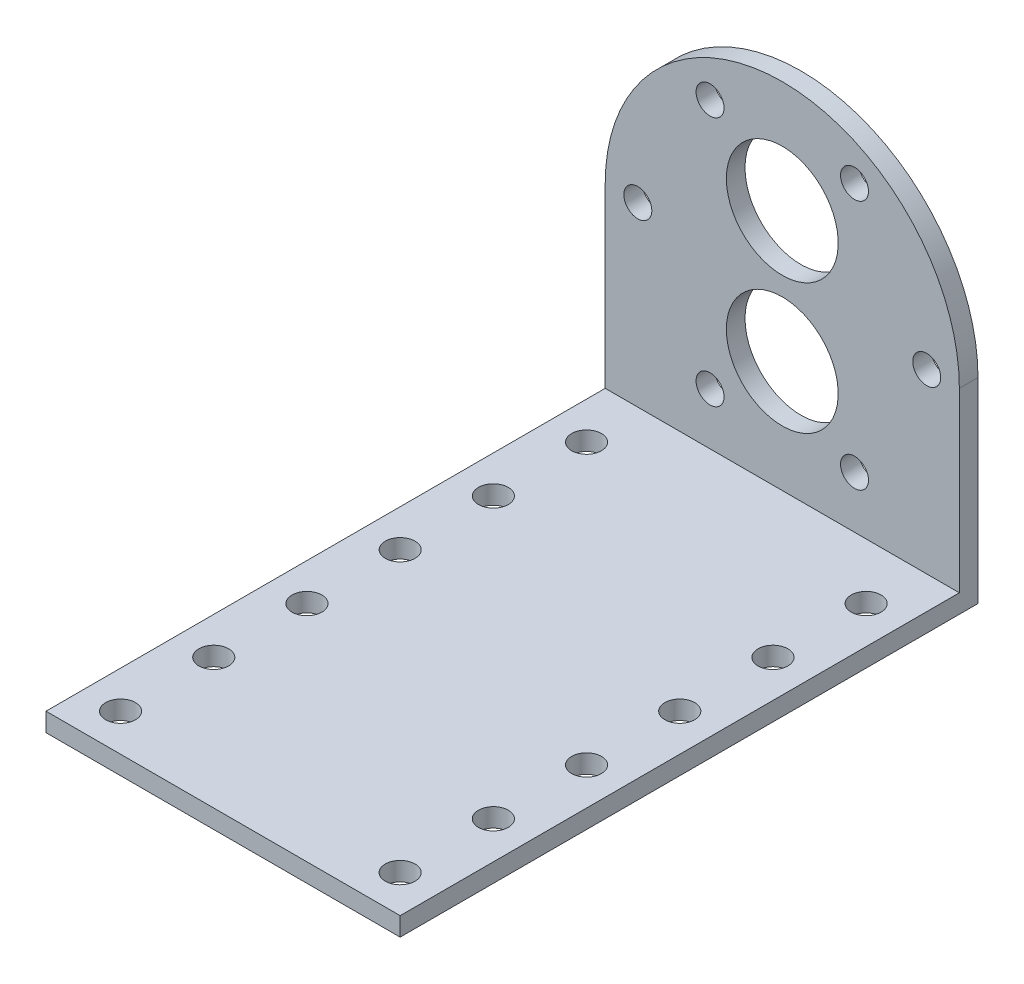
ISO-10303-21;
HEADER;
FILE_DESCRIPTION(('STEP AP214'),'2;1');
FILE_NAME('part.step','',(''),(''),'','','');
FILE_SCHEMA(('AUTOMOTIVE_DESIGN { 1 0 10303 214 1 1 1 1 }'));
ENDSEC;
DATA;
#1=APPLICATION_CONTEXT('core data for automotive mechanical design processes');
#2=APPLICATION_PROTOCOL_DEFINITION('international standard','automotive_design',2000,#1);
#3=PRODUCT_CONTEXT('',#1,'mechanical');
#4=PRODUCT('Part','Part','',(#3));
#5=PRODUCT_RELATED_PRODUCT_CATEGORY('part','',(#4));
#6=PRODUCT_DEFINITION_FORMATION('','',#4);
#7=PRODUCT_DEFINITION_CONTEXT('part definition',#1,'design');
#8=PRODUCT_DEFINITION('design','',#6,#7);
#9=PRODUCT_DEFINITION_SHAPE('','',#8);
#10=(LENGTH_UNIT() NAMED_UNIT(*) SI_UNIT(.MILLI.,.METRE.));
#11=(NAMED_UNIT(*) PLANE_ANGLE_UNIT() SI_UNIT($,.RADIAN.));
#12=(NAMED_UNIT(*) SI_UNIT($,.STERADIAN.) SOLID_ANGLE_UNIT());
#13=UNCERTAINTY_MEASURE_WITH_UNIT(LENGTH_MEASURE(1.E-05),#10,'distance_accuracy_value','');
#14=(GEOMETRIC_REPRESENTATION_CONTEXT(3) GLOBAL_UNCERTAINTY_ASSIGNED_CONTEXT((#13)) GLOBAL_UNIT_ASSIGNED_CONTEXT((#10,
#11,#12)) REPRESENTATION_CONTEXT('',''));
#15=CARTESIAN_POINT('',(0.,0.,0.));
#16=DIRECTION('',(0.,0.,1.));
#17=DIRECTION('',(1.,0.,0.));
#18=AXIS2_PLACEMENT_3D('',#15,#16,#17);
#19=CARTESIAN_POINT('',(0.,0.,2.));
#20=DIRECTION('',(0.,0.,-1.));
#21=DIRECTION('',(-1.,0.,0.));
#22=AXIS2_PLACEMENT_3D('',#19,#20,#21);
#23=CYLINDRICAL_SURFACE('',#22,19.);
#24=CARTESIAN_POINT('',(0.,0.,0.));
#25=DIRECTION('',(0.,0.,1.));
#26=DIRECTION('',(1.,0.,0.));
#27=AXIS2_PLACEMENT_3D('',#24,#25,#26);
#28=CIRCLE('',#27,19.);
#29=CARTESIAN_POINT('',(19.,0.,0.));
#30=VERTEX_POINT('',#29);
#31=CARTESIAN_POINT('',(-19.,0.,0.));
#32=VERTEX_POINT('',#31);
#33=EDGE_CURVE('E92',#30,#32,#28,.T.);
#34=ORIENTED_EDGE('',*,*,#33,.T.);
#35=DIRECTION('',(0.,0.,-1.));
#36=VECTOR('',#35,1.);
#37=CARTESIAN_POINT('',(-19.,0.,2.));
#38=LINE('',#37,#36);
#39=CARTESIAN_POINT('',(-19.,0.,2.));
#40=VERTEX_POINT('',#39);
#41=EDGE_CURVE('E11',#40,#32,#38,.T.);
#42=ORIENTED_EDGE('',*,*,#41,.F.);
#43=CARTESIAN_POINT('',(0.,0.,2.));
#44=DIRECTION('',(0.,0.,1.));
#45=DIRECTION('',(1.,0.,0.));
#46=AXIS2_PLACEMENT_3D('',#43,#44,#45);
#47=CIRCLE('',#46,19.);
#48=CARTESIAN_POINT('',(19.,0.,2.));
#49=VERTEX_POINT('',#48);
#50=EDGE_CURVE('E86',#49,#40,#47,.T.);
#51=ORIENTED_EDGE('',*,*,#50,.F.);
#52=DIRECTION('',(0.,0.,-1.));
#53=VECTOR('',#52,1.);
#54=CARTESIAN_POINT('',(19.,0.,2.));
#55=LINE('',#54,#53);
#56=EDGE_CURVE('E78',#49,#30,#55,.T.);
#57=ORIENTED_EDGE('',*,*,#56,.T.);
#58=EDGE_LOOP('',(#34,#42,#51,#57));
#59=FACE_BOUND('',#58,.T.);
#60=ADVANCED_FACE('F34',(#59),#23,.T.);
#61=CARTESIAN_POINT('',(-19.,0.,2.));
#62=DIRECTION('',(1.,0.,0.));
#63=DIRECTION('',(0.,0.,-1.));
#64=AXIS2_PLACEMENT_3D('',#61,#62,#63);
#65=PLANE('',#64);
#66=DIRECTION('',(0.,-1.,0.));
#67=VECTOR('',#66,1.);
#68=CARTESIAN_POINT('',(-19.,0.,0.));
#69=LINE('',#68,#67);
#70=CARTESIAN_POINT('',(-19.,-21.,0.));
#71=VERTEX_POINT('',#70);
#72=EDGE_CURVE('E95',#32,#71,#69,.T.);
#73=ORIENTED_EDGE('',*,*,#72,.T.);
#74=DIRECTION('',(0.,0.,-1.));
#75=VECTOR('',#74,1.);
#76=CARTESIAN_POINT('',(-19.,-21.,2.));
#77=LINE('',#76,#75);
#78=CARTESIAN_POINT('',(-19.,-21.,62.));
#79=VERTEX_POINT('',#78);
#80=EDGE_CURVE('E42',#79,#71,#77,.T.);
#81=ORIENTED_EDGE('',*,*,#80,.F.);
#82=DIRECTION('',(0.,-1.,0.));
#83=VECTOR('',#82,1.);
#84=CARTESIAN_POINT('',(-19.,-21.,62.));
#85=LINE('',#84,#83);
#86=CARTESIAN_POINT('',(-19.,-19.,62.));
#87=VERTEX_POINT('',#86);
#88=EDGE_CURVE('E120',#87,#79,#85,.T.);
#89=ORIENTED_EDGE('',*,*,#88,.F.);
#90=DIRECTION('',(0.,0.,-1.));
#91=VECTOR('',#90,1.);
#92=CARTESIAN_POINT('',(-19.,-19.,62.));
#93=LINE('',#92,#91);
#94=CARTESIAN_POINT('',(-19.,-19.,2.));
#95=VERTEX_POINT('',#94);
#96=EDGE_CURVE('E100',#87,#95,#93,.T.);
#97=ORIENTED_EDGE('',*,*,#96,.T.);
#98=DIRECTION('',(0.,-1.,0.));
#99=VECTOR('',#98,1.);
#100=CARTESIAN_POINT('',(-19.,0.,2.));
#101=LINE('',#100,#99);
#102=EDGE_CURVE('E109',#40,#95,#101,.T.);
#103=ORIENTED_EDGE('',*,*,#102,.F.);
#104=ORIENTED_EDGE('',*,*,#41,.T.);
#105=EDGE_LOOP('',(#73,#81,#89,#97,#103,#104));
#106=FACE_BOUND('',#105,.T.);
#107=ADVANCED_FACE('F301',(#106),#65,.F.);
#108=CARTESIAN_POINT('',(-19.,-21.,2.));
#109=DIRECTION('',(0.,1.,0.));
#110=DIRECTION('',(0.,0.,1.));
#111=AXIS2_PLACEMENT_3D('',#108,#109,#110);
#112=PLANE('',#111);
#113=CARTESIAN_POINT('',(15.,-21.,58.));
#114=DIRECTION('',(0.,1.,0.));
#115=DIRECTION('',(0.,0.,1.));
#116=AXIS2_PLACEMENT_3D('',#113,#114,#115);
#117=CIRCLE('',#116,1.6);
#118=CARTESIAN_POINT('',(15.,-21.,59.6));
#119=VERTEX_POINT('',#118);
#120=EDGE_CURVE('E205',#119,#119,#117,.T.);
#121=ORIENTED_EDGE('',*,*,#120,.T.);
#122=EDGE_LOOP('',(#121));
#123=FACE_BOUND('',#122,.T.);
#124=CARTESIAN_POINT('',(-15.,-21.,58.));
#125=DIRECTION('',(0.,1.,0.));
#126=DIRECTION('',(0.,0.,1.));
#127=AXIS2_PLACEMENT_3D('',#124,#125,#126);
#128=CIRCLE('',#127,1.6);
#129=CARTESIAN_POINT('',(-15.,-21.,59.6));
#130=VERTEX_POINT('',#129);
#131=EDGE_CURVE('E199',#130,#130,#128,.T.);
#132=ORIENTED_EDGE('',*,*,#131,.T.);
#133=EDGE_LOOP('',(#132));
#134=FACE_BOUND('',#133,.T.);
#135=CARTESIAN_POINT('',(15.,-21.,48.));
#136=DIRECTION('',(0.,1.,0.));
#137=DIRECTION('',(0.,0.,1.));
#138=AXIS2_PLACEMENT_3D('',#135,#136,#137);
#139=CIRCLE('',#138,1.6);
#140=CARTESIAN_POINT('',(15.,-21.,49.6));
#141=VERTEX_POINT('',#140);
#142=EDGE_CURVE('E193',#141,#141,#139,.T.);
#143=ORIENTED_EDGE('',*,*,#142,.T.);
#144=EDGE_LOOP('',(#143));
#145=FACE_BOUND('',#144,.T.);
#146=CARTESIAN_POINT('',(15.,-21.,38.));
#147=DIRECTION('',(0.,1.,0.));
#148=DIRECTION('',(0.,0.,1.));
#149=AXIS2_PLACEMENT_3D('',#146,#147,#148);
#150=CIRCLE('',#149,1.6);
#151=CARTESIAN_POINT('',(15.,-21.,39.6));
#152=VERTEX_POINT('',#151);
#153=EDGE_CURVE('E187',#152,#152,#150,.T.);
#154=ORIENTED_EDGE('',*,*,#153,.T.);
#155=EDGE_LOOP('',(#154));
#156=FACE_BOUND('',#155,.T.);
#157=CARTESIAN_POINT('',(15.,-21.,28.));
#158=DIRECTION('',(0.,1.,0.));
#159=DIRECTION('',(0.,0.,1.));
#160=AXIS2_PLACEMENT_3D('',#157,#158,#159);
#161=CIRCLE('',#160,1.6);
#162=CARTESIAN_POINT('',(15.,-21.,29.6));
#163=VERTEX_POINT('',#162);
#164=EDGE_CURVE('E181',#163,#163,#161,.T.);
#165=ORIENTED_EDGE('',*,*,#164,.T.);
#166=EDGE_LOOP('',(#165));
#167=FACE_BOUND('',#166,.T.);
#168=CARTESIAN_POINT('',(15.,-21.,18.));
#169=DIRECTION('',(0.,1.,0.));
#170=DIRECTION('',(0.,0.,1.));
#171=AXIS2_PLACEMENT_3D('',#168,#169,#170);
#172=CIRCLE('',#171,1.6);
#173=CARTESIAN_POINT('',(15.,-21.,19.6));
#174=VERTEX_POINT('',#173);
#175=EDGE_CURVE('E175',#174,#174,#172,.T.);
#176=ORIENTED_EDGE('',*,*,#175,.T.);
#177=EDGE_LOOP('',(#176));
#178=FACE_BOUND('',#177,.T.);
#179=CARTESIAN_POINT('',(15.,-21.,8.));
#180=DIRECTION('',(0.,1.,0.));
#181=DIRECTION('',(0.,0.,1.));
#182=AXIS2_PLACEMENT_3D('',#179,#180,#181);
#183=CIRCLE('',#182,1.6);
#184=CARTESIAN_POINT('',(15.,-21.,9.6));
#185=VERTEX_POINT('',#184);
#186=EDGE_CURVE('E169',#185,#185,#183,.T.);
#187=ORIENTED_EDGE('',*,*,#186,.T.);
#188=EDGE_LOOP('',(#187));
#189=FACE_BOUND('',#188,.T.);
#190=CARTESIAN_POINT('',(-15.,-21.,48.));
#191=DIRECTION('',(0.,1.,0.));
#192=DIRECTION('',(0.,0.,1.));
#193=AXIS2_PLACEMENT_3D('',#190,#191,#192);
#194=CIRCLE('',#193,1.6);
#195=CARTESIAN_POINT('',(-15.,-21.,49.6));
#196=VERTEX_POINT('',#195);
#197=EDGE_CURVE('E163',#196,#196,#194,.T.);
#198=ORIENTED_EDGE('',*,*,#197,.T.);
#199=EDGE_LOOP('',(#198));
#200=FACE_BOUND('',#199,.T.);
#201=CARTESIAN_POINT('',(-15.,-21.,28.));
#202=DIRECTION('',(0.,1.,0.));
#203=DIRECTION('',(0.,0.,1.));
#204=AXIS2_PLACEMENT_3D('',#201,#202,#203);
#205=CIRCLE('',#204,1.6);
#206=CARTESIAN_POINT('',(-15.,-21.,29.6));
#207=VERTEX_POINT('',#206);
#208=EDGE_CURVE('E157',#207,#207,#205,.T.);
#209=ORIENTED_EDGE('',*,*,#208,.T.);
#210=EDGE_LOOP('',(#209));
#211=FACE_BOUND('',#210,.T.);
#212=CARTESIAN_POINT('',(-15.,-21.,38.));
#213=DIRECTION('',(0.,1.,0.));
#214=DIRECTION('',(0.,0.,1.));
#215=AXIS2_PLACEMENT_3D('',#212,#213,#214);
#216=CIRCLE('',#215,1.6);
#217=CARTESIAN_POINT('',(-15.,-21.,39.6));
#218=VERTEX_POINT('',#217);
#219=EDGE_CURVE('E151',#218,#218,#216,.T.);
#220=ORIENTED_EDGE('',*,*,#219,.T.);
#221=EDGE_LOOP('',(#220));
#222=FACE_BOUND('',#221,.T.);
#223=CARTESIAN_POINT('',(-15.,-21.,8.));
#224=DIRECTION('',(0.,1.,0.));
#225=DIRECTION('',(0.,0.,1.));
#226=AXIS2_PLACEMENT_3D('',#223,#224,#225);
#227=CIRCLE('',#226,1.6);
#228=CARTESIAN_POINT('',(-15.,-21.,9.6));
#229=VERTEX_POINT('',#228);
#230=EDGE_CURVE('E145',#229,#229,#227,.T.);
#231=ORIENTED_EDGE('',*,*,#230,.T.);
#232=EDGE_LOOP('',(#231));
#233=FACE_BOUND('',#232,.T.);
#234=CARTESIAN_POINT('',(-15.,-21.,18.));
#235=DIRECTION('',(0.,1.,0.));
#236=DIRECTION('',(0.,0.,1.));
#237=AXIS2_PLACEMENT_3D('',#234,#235,#236);
#238=CIRCLE('',#237,1.6);
#239=CARTESIAN_POINT('',(-15.,-21.,19.6));
#240=VERTEX_POINT('',#239);
#241=EDGE_CURVE('E121',#240,#240,#238,.T.);
#242=ORIENTED_EDGE('',*,*,#241,.T.);
#243=EDGE_LOOP('',(#242));
#244=FACE_BOUND('',#243,.T.);
#245=DIRECTION('',(1.,0.,0.));
#246=VECTOR('',#245,1.);
#247=CARTESIAN_POINT('',(-19.,-21.,0.));
#248=LINE('',#247,#246);
#249=CARTESIAN_POINT('',(19.,-21.,0.));
#250=VERTEX_POINT('',#249);
#251=EDGE_CURVE('E87',#71,#250,#248,.T.);
#252=ORIENTED_EDGE('',*,*,#251,.T.);
#253=DIRECTION('',(0.,0.,-1.));
#254=VECTOR('',#253,1.);
#255=CARTESIAN_POINT('',(19.,-21.,2.));
#256=LINE('',#255,#254);
#257=CARTESIAN_POINT('',(19.,-21.,62.));
#258=VERTEX_POINT('',#257);
#259=EDGE_CURVE('E82',#258,#250,#256,.T.);
#260=ORIENTED_EDGE('',*,*,#259,.F.);
#261=DIRECTION('',(1.,0.,0.));
#262=VECTOR('',#261,1.);
#263=CARTESIAN_POINT('',(-19.,-21.,62.));
#264=LINE('',#263,#262);
#265=EDGE_CURVE('E135',#79,#258,#264,.T.);
#266=ORIENTED_EDGE('',*,*,#265,.F.);
#267=ORIENTED_EDGE('',*,*,#80,.T.);
#268=EDGE_LOOP('',(#252,#260,#266,#267));
#269=FACE_BOUND('',#268,.T.);
#270=ADVANCED_FACE('F305',(#123,#134,#145,#156,#167,#178,#189,#200,#211,#222,#233,#244,#269),
#112,.F.);
#271=CARTESIAN_POINT('',(19.,-21.,2.));
#272=DIRECTION('',(-1.,0.,0.));
#273=DIRECTION('',(0.,0.,1.));
#274=AXIS2_PLACEMENT_3D('',#271,#272,#273);
#275=PLANE('',#274);
#276=DIRECTION('',(0.,1.,0.));
#277=VECTOR('',#276,1.);
#278=CARTESIAN_POINT('',(19.,-21.,0.));
#279=LINE('',#278,#277);
#280=EDGE_CURVE('E75',#250,#30,#279,.T.);
#281=ORIENTED_EDGE('',*,*,#280,.T.);
#282=ORIENTED_EDGE('',*,*,#56,.F.);
#283=DIRECTION('',(0.,1.,0.));
#284=VECTOR('',#283,1.);
#285=CARTESIAN_POINT('',(19.,-21.,2.));
#286=LINE('',#285,#284);
#287=CARTESIAN_POINT('',(19.,-19.,2.));
#288=VERTEX_POINT('',#287);
#289=EDGE_CURVE('E55',#288,#49,#286,.T.);
#290=ORIENTED_EDGE('',*,*,#289,.F.);
#291=DIRECTION('',(0.,0.,-1.));
#292=VECTOR('',#291,1.);
#293=CARTESIAN_POINT('',(19.,-19.,62.));
#294=LINE('',#293,#292);
#295=CARTESIAN_POINT('',(19.,-19.,62.));
#296=VERTEX_POINT('',#295);
#297=EDGE_CURVE('E96',#296,#288,#294,.T.);
#298=ORIENTED_EDGE('',*,*,#297,.F.);
#299=DIRECTION('',(0.,1.,0.));
#300=VECTOR('',#299,1.);
#301=CARTESIAN_POINT('',(19.,-21.,62.));
#302=LINE('',#301,#300);
#303=EDGE_CURVE('E130',#258,#296,#302,.T.);
#304=ORIENTED_EDGE('',*,*,#303,.F.);
#305=ORIENTED_EDGE('',*,*,#259,.T.);
#306=EDGE_LOOP('',(#281,#282,#290,#298,#304,#305));
#307=FACE_BOUND('',#306,.T.);
#308=ADVANCED_FACE('F77',(#307),#275,.F.);
#309=CARTESIAN_POINT('',(0.,0.,2.));
#310=DIRECTION('',(0.,0.,1.));
#311=DIRECTION('',(1.,0.,0.));
#312=AXIS2_PLACEMENT_3D('',#309,#310,#311);
#313=PLANE('',#312);
#314=CARTESIAN_POINT('',(7.75000000000006,-13.4233937586588,2.));
#315=DIRECTION('',(0.,0.,-1.));
#316=DIRECTION('',(-1.,0.,0.));
#317=AXIS2_PLACEMENT_3D('',#314,#315,#316);
#318=CIRCLE('',#317,1.5);
#319=CARTESIAN_POINT('',(6.25000000000006,-13.4233937586588,2.));
#320=VERTEX_POINT('',#319);
#321=EDGE_CURVE('E256',#320,#320,#318,.T.);
#322=ORIENTED_EDGE('',*,*,#321,.T.);
#323=EDGE_LOOP('',(#322));
#324=FACE_BOUND('',#323,.T.);
#325=CARTESIAN_POINT('',(7.75000000000007,13.4233937586588,2.));
#326=DIRECTION('',(0.,0.,-1.));
#327=DIRECTION('',(-1.,0.,0.));
#328=AXIS2_PLACEMENT_3D('',#325,#326,#327);
#329=CIRCLE('',#328,1.5);
#330=CARTESIAN_POINT('',(6.25000000000007,13.4233937586588,2.));
#331=VERTEX_POINT('',#330);
#332=EDGE_CURVE('E250',#331,#331,#329,.T.);
#333=ORIENTED_EDGE('',*,*,#332,.T.);
#334=EDGE_LOOP('',(#333));
#335=FACE_BOUND('',#334,.T.);
#336=CARTESIAN_POINT('',(15.5,0.,2.));
#337=DIRECTION('',(0.,0.,-1.));
#338=DIRECTION('',(-1.,0.,0.));
#339=AXIS2_PLACEMENT_3D('',#336,#337,#338);
#340=CIRCLE('',#339,1.5);
#341=CARTESIAN_POINT('',(14.,0.,2.));
#342=VERTEX_POINT('',#341);
#343=EDGE_CURVE('E244',#342,#342,#340,.T.);
#344=ORIENTED_EDGE('',*,*,#343,.T.);
#345=EDGE_LOOP('',(#344));
#346=FACE_BOUND('',#345,.T.);
#347=CARTESIAN_POINT('',(-7.74999999999988,-13.4233937586589,2.));
#348=DIRECTION('',(0.,0.,-1.));
#349=DIRECTION('',(-1.,0.,0.));
#350=AXIS2_PLACEMENT_3D('',#347,#348,#349);
#351=CIRCLE('',#350,1.5);
#352=CARTESIAN_POINT('',(-9.24999999999988,-13.4233937586589,2.));
#353=VERTEX_POINT('',#352);
#354=EDGE_CURVE('E238',#353,#353,#351,.T.);
#355=ORIENTED_EDGE('',*,*,#354,.T.);
#356=EDGE_LOOP('',(#355));
#357=FACE_BOUND('',#356,.T.);
#358=CARTESIAN_POINT('',(-15.5,0.,2.));
#359=DIRECTION('',(0.,0.,-1.));
#360=DIRECTION('',(-1.,0.,0.));
#361=AXIS2_PLACEMENT_3D('',#358,#359,#360);
#362=CIRCLE('',#361,1.5);
#363=CARTESIAN_POINT('',(-17.,0.,2.));
#364=VERTEX_POINT('',#363);
#365=EDGE_CURVE('E232',#364,#364,#362,.T.);
#366=ORIENTED_EDGE('',*,*,#365,.T.);
#367=EDGE_LOOP('',(#366));
#368=FACE_BOUND('',#367,.T.);
#369=CARTESIAN_POINT('',(-7.75000000000006,13.4233937586588,2.));
#370=DIRECTION('',(0.,0.,-1.));
#371=DIRECTION('',(-1.,0.,0.));
#372=AXIS2_PLACEMENT_3D('',#369,#370,#371);
#373=CIRCLE('',#372,1.5);
#374=CARTESIAN_POINT('',(-9.25000000000006,13.4233937586588,2.));
#375=VERTEX_POINT('',#374);
#376=EDGE_CURVE('E226',#375,#375,#373,.T.);
#377=ORIENTED_EDGE('',*,*,#376,.T.);
#378=EDGE_LOOP('',(#377));
#379=FACE_BOUND('',#378,.T.);
#380=CARTESIAN_POINT('',(0.,7.,2.));
#381=DIRECTION('',(0.,0.,-1.));
#382=DIRECTION('',(-1.,0.,0.));
#383=AXIS2_PLACEMENT_3D('',#380,#381,#382);
#384=CIRCLE('',#383,6.);
#385=CARTESIAN_POINT('',(-6.,7.,2.));
#386=VERTEX_POINT('',#385);
#387=EDGE_CURVE('E220',#386,#386,#384,.T.);
#388=ORIENTED_EDGE('',*,*,#387,.T.);
#389=EDGE_LOOP('',(#388));
#390=FACE_BOUND('',#389,.T.);
#391=CARTESIAN_POINT('',(0.,-7.,2.));
#392=DIRECTION('',(0.,0.,-1.));
#393=DIRECTION('',(-1.,0.,0.));
#394=AXIS2_PLACEMENT_3D('',#391,#392,#393);
#395=CIRCLE('',#394,6.);
#396=CARTESIAN_POINT('',(-6.,-7.,2.));
#397=VERTEX_POINT('',#396);
#398=EDGE_CURVE('E211',#397,#397,#395,.T.);
#399=ORIENTED_EDGE('',*,*,#398,.T.);
#400=EDGE_LOOP('',(#399));
#401=FACE_BOUND('',#400,.T.);
#402=DIRECTION('',(-1.,0.,0.));
#403=VECTOR('',#402,1.);
#404=CARTESIAN_POINT('',(-19.,-19.,2.));
#405=LINE('',#404,#403);
#406=EDGE_CURVE('E50',#288,#95,#405,.T.);
#407=ORIENTED_EDGE('',*,*,#406,.F.);
#408=ORIENTED_EDGE('',*,*,#289,.T.);
#409=ORIENTED_EDGE('',*,*,#50,.T.);
#410=ORIENTED_EDGE('',*,*,#102,.T.);
#411=EDGE_LOOP('',(#407,#408,#409,#410));
#412=FACE_BOUND('',#411,.T.);
#413=ADVANCED_FACE('F267',(#324,#335,#346,#357,#368,#379,#390,#401,#412),#313,.T.);
#414=CARTESIAN_POINT('',(0.,0.,0.));
#415=DIRECTION('',(0.,0.,1.));
#416=DIRECTION('',(1.,0.,0.));
#417=AXIS2_PLACEMENT_3D('',#414,#415,#416);
#418=PLANE('',#417);
#419=CARTESIAN_POINT('',(7.75000000000006,-13.4233937586588,0.));
#420=DIRECTION('',(0.,0.,-1.));
#421=DIRECTION('',(-1.,0.,0.));
#422=AXIS2_PLACEMENT_3D('',#419,#420,#421);
#423=CIRCLE('',#422,1.5);
#424=CARTESIAN_POINT('',(6.25000000000006,-13.4233937586588,0.));
#425=VERTEX_POINT('',#424);
#426=EDGE_CURVE('E253',#425,#425,#423,.T.);
#427=ORIENTED_EDGE('',*,*,#426,.F.);
#428=EDGE_LOOP('',(#427));
#429=FACE_BOUND('',#428,.T.);
#430=CARTESIAN_POINT('',(7.75000000000007,13.4233937586588,0.));
#431=DIRECTION('',(0.,0.,-1.));
#432=DIRECTION('',(-1.,0.,0.));
#433=AXIS2_PLACEMENT_3D('',#430,#431,#432);
#434=CIRCLE('',#433,1.5);
#435=CARTESIAN_POINT('',(6.25000000000007,13.4233937586588,0.));
#436=VERTEX_POINT('',#435);
#437=EDGE_CURVE('E247',#436,#436,#434,.T.);
#438=ORIENTED_EDGE('',*,*,#437,.F.);
#439=EDGE_LOOP('',(#438));
#440=FACE_BOUND('',#439,.T.);
#441=CARTESIAN_POINT('',(15.5,0.,0.));
#442=DIRECTION('',(0.,0.,-1.));
#443=DIRECTION('',(-1.,0.,0.));
#444=AXIS2_PLACEMENT_3D('',#441,#442,#443);
#445=CIRCLE('',#444,1.5);
#446=CARTESIAN_POINT('',(14.,0.,0.));
#447=VERTEX_POINT('',#446);
#448=EDGE_CURVE('E241',#447,#447,#445,.T.);
#449=ORIENTED_EDGE('',*,*,#448,.F.);
#450=EDGE_LOOP('',(#449));
#451=FACE_BOUND('',#450,.T.);
#452=CARTESIAN_POINT('',(-7.74999999999988,-13.4233937586589,0.));
#453=DIRECTION('',(0.,0.,-1.));
#454=DIRECTION('',(-1.,0.,0.));
#455=AXIS2_PLACEMENT_3D('',#452,#453,#454);
#456=CIRCLE('',#455,1.5);
#457=CARTESIAN_POINT('',(-9.24999999999988,-13.4233937586589,0.));
#458=VERTEX_POINT('',#457);
#459=EDGE_CURVE('E235',#458,#458,#456,.T.);
#460=ORIENTED_EDGE('',*,*,#459,.F.);
#461=EDGE_LOOP('',(#460));
#462=FACE_BOUND('',#461,.T.);
#463=CARTESIAN_POINT('',(-15.5,0.,0.));
#464=DIRECTION('',(0.,0.,-1.));
#465=DIRECTION('',(-1.,0.,0.));
#466=AXIS2_PLACEMENT_3D('',#463,#464,#465);
#467=CIRCLE('',#466,1.5);
#468=CARTESIAN_POINT('',(-17.,0.,0.));
#469=VERTEX_POINT('',#468);
#470=EDGE_CURVE('E229',#469,#469,#467,.T.);
#471=ORIENTED_EDGE('',*,*,#470,.F.);
#472=EDGE_LOOP('',(#471));
#473=FACE_BOUND('',#472,.T.);
#474=CARTESIAN_POINT('',(-7.75000000000006,13.4233937586588,0.));
#475=DIRECTION('',(0.,0.,-1.));
#476=DIRECTION('',(-1.,0.,0.));
#477=AXIS2_PLACEMENT_3D('',#474,#475,#476);
#478=CIRCLE('',#477,1.5);
#479=CARTESIAN_POINT('',(-9.25000000000006,13.4233937586588,0.));
#480=VERTEX_POINT('',#479);
#481=EDGE_CURVE('E223',#480,#480,#478,.T.);
#482=ORIENTED_EDGE('',*,*,#481,.F.);
#483=EDGE_LOOP('',(#482));
#484=FACE_BOUND('',#483,.T.);
#485=CARTESIAN_POINT('',(0.,7.,0.));
#486=DIRECTION('',(0.,0.,-1.));
#487=DIRECTION('',(-1.,0.,0.));
#488=AXIS2_PLACEMENT_3D('',#485,#486,#487);
#489=CIRCLE('',#488,6.);
#490=CARTESIAN_POINT('',(-6.,7.,0.));
#491=VERTEX_POINT('',#490);
#492=EDGE_CURVE('E217',#491,#491,#489,.T.);
#493=ORIENTED_EDGE('',*,*,#492,.F.);
#494=EDGE_LOOP('',(#493));
#495=FACE_BOUND('',#494,.T.);
#496=CARTESIAN_POINT('',(0.,-7.,0.));
#497=DIRECTION('',(0.,0.,-1.));
#498=DIRECTION('',(-1.,0.,0.));
#499=AXIS2_PLACEMENT_3D('',#496,#497,#498);
#500=CIRCLE('',#499,6.);
#501=CARTESIAN_POINT('',(-6.,-7.,0.));
#502=VERTEX_POINT('',#501);
#503=EDGE_CURVE('E214',#502,#502,#500,.T.);
#504=ORIENTED_EDGE('',*,*,#503,.F.);
#505=EDGE_LOOP('',(#504));
#506=FACE_BOUND('',#505,.T.);
#507=ORIENTED_EDGE('',*,*,#33,.F.);
#508=ORIENTED_EDGE('',*,*,#280,.F.);
#509=ORIENTED_EDGE('',*,*,#251,.F.);
#510=ORIENTED_EDGE('',*,*,#72,.F.);
#511=EDGE_LOOP('',(#507,#508,#509,#510));
#512=FACE_BOUND('',#511,.T.);
#513=ADVANCED_FACE('F94',(#429,#440,#451,#462,#473,#484,#495,#506,#512),#418,.F.);
#514=CARTESIAN_POINT('',(-19.,-19.,62.));
#515=DIRECTION('',(0.,-1.,0.));
#516=DIRECTION('',(0.,0.,-1.));
#517=AXIS2_PLACEMENT_3D('',#514,#515,#516);
#518=PLANE('',#517);
#519=CARTESIAN_POINT('',(15.,-19.,58.));
#520=DIRECTION('',(0.,1.,0.));
#521=DIRECTION('',(0.,0.,1.));
#522=AXIS2_PLACEMENT_3D('',#519,#520,#521);
#523=CIRCLE('',#522,1.6);
#524=CARTESIAN_POINT('',(15.,-19.,59.6));
#525=VERTEX_POINT('',#524);
#526=EDGE_CURVE('E208',#525,#525,#523,.T.);
#527=ORIENTED_EDGE('',*,*,#526,.F.);
#528=EDGE_LOOP('',(#527));
#529=FACE_BOUND('',#528,.T.);
#530=CARTESIAN_POINT('',(-15.,-19.,58.));
#531=DIRECTION('',(0.,1.,0.));
#532=DIRECTION('',(0.,0.,1.));
#533=AXIS2_PLACEMENT_3D('',#530,#531,#532);
#534=CIRCLE('',#533,1.6);
#535=CARTESIAN_POINT('',(-15.,-19.,59.6));
#536=VERTEX_POINT('',#535);
#537=EDGE_CURVE('E202',#536,#536,#534,.T.);
#538=ORIENTED_EDGE('',*,*,#537,.F.);
#539=EDGE_LOOP('',(#538));
#540=FACE_BOUND('',#539,.T.);
#541=CARTESIAN_POINT('',(15.,-19.,48.));
#542=DIRECTION('',(0.,1.,0.));
#543=DIRECTION('',(0.,0.,1.));
#544=AXIS2_PLACEMENT_3D('',#541,#542,#543);
#545=CIRCLE('',#544,1.6);
#546=CARTESIAN_POINT('',(15.,-19.,49.6));
#547=VERTEX_POINT('',#546);
#548=EDGE_CURVE('E196',#547,#547,#545,.T.);
#549=ORIENTED_EDGE('',*,*,#548,.F.);
#550=EDGE_LOOP('',(#549));
#551=FACE_BOUND('',#550,.T.);
#552=CARTESIAN_POINT('',(15.,-19.,38.));
#553=DIRECTION('',(0.,1.,0.));
#554=DIRECTION('',(0.,0.,1.));
#555=AXIS2_PLACEMENT_3D('',#552,#553,#554);
#556=CIRCLE('',#555,1.6);
#557=CARTESIAN_POINT('',(15.,-19.,39.6));
#558=VERTEX_POINT('',#557);
#559=EDGE_CURVE('E190',#558,#558,#556,.T.);
#560=ORIENTED_EDGE('',*,*,#559,.F.);
#561=EDGE_LOOP('',(#560));
#562=FACE_BOUND('',#561,.T.);
#563=CARTESIAN_POINT('',(15.,-19.,28.));
#564=DIRECTION('',(0.,1.,0.));
#565=DIRECTION('',(0.,0.,1.));
#566=AXIS2_PLACEMENT_3D('',#563,#564,#565);
#567=CIRCLE('',#566,1.6);
#568=CARTESIAN_POINT('',(15.,-19.,29.6));
#569=VERTEX_POINT('',#568);
#570=EDGE_CURVE('E184',#569,#569,#567,.T.);
#571=ORIENTED_EDGE('',*,*,#570,.F.);
#572=EDGE_LOOP('',(#571));
#573=FACE_BOUND('',#572,.T.);
#574=CARTESIAN_POINT('',(15.,-19.,18.));
#575=DIRECTION('',(0.,1.,0.));
#576=DIRECTION('',(0.,0.,1.));
#577=AXIS2_PLACEMENT_3D('',#574,#575,#576);
#578=CIRCLE('',#577,1.6);
#579=CARTESIAN_POINT('',(15.,-19.,19.6));
#580=VERTEX_POINT('',#579);
#581=EDGE_CURVE('E178',#580,#580,#578,.T.);
#582=ORIENTED_EDGE('',*,*,#581,.F.);
#583=EDGE_LOOP('',(#582));
#584=FACE_BOUND('',#583,.T.);
#585=CARTESIAN_POINT('',(15.,-19.,8.));
#586=DIRECTION('',(0.,1.,0.));
#587=DIRECTION('',(0.,0.,1.));
#588=AXIS2_PLACEMENT_3D('',#585,#586,#587);
#589=CIRCLE('',#588,1.6);
#590=CARTESIAN_POINT('',(15.,-19.,9.6));
#591=VERTEX_POINT('',#590);
#592=EDGE_CURVE('E172',#591,#591,#589,.T.);
#593=ORIENTED_EDGE('',*,*,#592,.F.);
#594=EDGE_LOOP('',(#593));
#595=FACE_BOUND('',#594,.T.);
#596=CARTESIAN_POINT('',(-15.,-19.,48.));
#597=DIRECTION('',(0.,1.,0.));
#598=DIRECTION('',(0.,0.,1.));
#599=AXIS2_PLACEMENT_3D('',#596,#597,#598);
#600=CIRCLE('',#599,1.6);
#601=CARTESIAN_POINT('',(-15.,-19.,49.6));
#602=VERTEX_POINT('',#601);
#603=EDGE_CURVE('E166',#602,#602,#600,.T.);
#604=ORIENTED_EDGE('',*,*,#603,.F.);
#605=EDGE_LOOP('',(#604));
#606=FACE_BOUND('',#605,.T.);
#607=CARTESIAN_POINT('',(-15.,-19.,28.));
#608=DIRECTION('',(0.,1.,0.));
#609=DIRECTION('',(0.,0.,1.));
#610=AXIS2_PLACEMENT_3D('',#607,#608,#609);
#611=CIRCLE('',#610,1.6);
#612=CARTESIAN_POINT('',(-15.,-19.,29.6));
#613=VERTEX_POINT('',#612);
#614=EDGE_CURVE('E160',#613,#613,#611,.T.);
#615=ORIENTED_EDGE('',*,*,#614,.F.);
#616=EDGE_LOOP('',(#615));
#617=FACE_BOUND('',#616,.T.);
#618=CARTESIAN_POINT('',(-15.,-19.,38.));
#619=DIRECTION('',(0.,1.,0.));
#620=DIRECTION('',(0.,0.,1.));
#621=AXIS2_PLACEMENT_3D('',#618,#619,#620);
#622=CIRCLE('',#621,1.6);
#623=CARTESIAN_POINT('',(-15.,-19.,39.6));
#624=VERTEX_POINT('',#623);
#625=EDGE_CURVE('E154',#624,#624,#622,.T.);
#626=ORIENTED_EDGE('',*,*,#625,.F.);
#627=EDGE_LOOP('',(#626));
#628=FACE_BOUND('',#627,.T.);
#629=CARTESIAN_POINT('',(-15.,-19.,8.));
#630=DIRECTION('',(0.,1.,0.));
#631=DIRECTION('',(0.,0.,1.));
#632=AXIS2_PLACEMENT_3D('',#629,#630,#631);
#633=CIRCLE('',#632,1.6);
#634=CARTESIAN_POINT('',(-15.,-19.,9.6));
#635=VERTEX_POINT('',#634);
#636=EDGE_CURVE('E148',#635,#635,#633,.T.);
#637=ORIENTED_EDGE('',*,*,#636,.F.);
#638=EDGE_LOOP('',(#637));
#639=FACE_BOUND('',#638,.T.);
#640=CARTESIAN_POINT('',(-15.,-19.,18.));
#641=DIRECTION('',(0.,1.,0.));
#642=DIRECTION('',(0.,0.,1.));
#643=AXIS2_PLACEMENT_3D('',#640,#641,#642);
#644=CIRCLE('',#643,1.6);
#645=CARTESIAN_POINT('',(-15.,-19.,19.6));
#646=VERTEX_POINT('',#645);
#647=EDGE_CURVE('E142',#646,#646,#644,.T.);
#648=ORIENTED_EDGE('',*,*,#647,.F.);
#649=EDGE_LOOP('',(#648));
#650=FACE_BOUND('',#649,.T.);
#651=ORIENTED_EDGE('',*,*,#406,.T.);
#652=ORIENTED_EDGE('',*,*,#96,.F.);
#653=DIRECTION('',(-1.,0.,0.));
#654=VECTOR('',#653,1.);
#655=CARTESIAN_POINT('',(-19.,-19.,62.));
#656=LINE('',#655,#654);
#657=EDGE_CURVE('E117',#296,#87,#656,.T.);
#658=ORIENTED_EDGE('',*,*,#657,.F.);
#659=ORIENTED_EDGE('',*,*,#297,.T.);
#660=EDGE_LOOP('',(#651,#652,#658,#659));
#661=FACE_BOUND('',#660,.T.);
#662=ADVANCED_FACE('F266',(#529,#540,#551,#562,#573,#584,#595,#606,#617,#628,#639,#650,#661),
#518,.F.);
#663=CARTESIAN_POINT('',(0.,0.,62.));
#664=DIRECTION('',(0.,0.,-1.));
#665=DIRECTION('',(-1.,0.,0.));
#666=AXIS2_PLACEMENT_3D('',#663,#664,#665);
#667=PLANE('',#666);
#668=ORIENTED_EDGE('',*,*,#88,.T.);
#669=ORIENTED_EDGE('',*,*,#265,.T.);
#670=ORIENTED_EDGE('',*,*,#303,.T.);
#671=ORIENTED_EDGE('',*,*,#657,.T.);
#672=EDGE_LOOP('',(#668,#669,#670,#671));
#673=FACE_BOUND('',#672,.T.);
#674=ADVANCED_FACE('F319',(#673),#667,.F.);
#675=CARTESIAN_POINT('',(-15.,-21.,18.));
#676=DIRECTION('',(0.,1.,0.));
#677=DIRECTION('',(0.,0.,1.));
#678=AXIS2_PLACEMENT_3D('',#675,#676,#677);
#679=CYLINDRICAL_SURFACE('',#678,1.6);
#680=ORIENTED_EDGE('',*,*,#241,.F.);
#681=EDGE_LOOP('',(#680));
#682=FACE_BOUND('',#681,.T.);
#683=ORIENTED_EDGE('',*,*,#647,.T.);
#684=EDGE_LOOP('',(#683));
#685=FACE_BOUND('',#684,.T.);
#686=ADVANCED_FACE('F323',(#682,#685),#679,.F.);
#687=CARTESIAN_POINT('',(-15.,-21.,8.));
#688=DIRECTION('',(0.,1.,0.));
#689=DIRECTION('',(0.,0.,1.));
#690=AXIS2_PLACEMENT_3D('',#687,#688,#689);
#691=CYLINDRICAL_SURFACE('',#690,1.6);
#692=ORIENTED_EDGE('',*,*,#230,.F.);
#693=EDGE_LOOP('',(#692));
#694=FACE_BOUND('',#693,.T.);
#695=ORIENTED_EDGE('',*,*,#636,.T.);
#696=EDGE_LOOP('',(#695));
#697=FACE_BOUND('',#696,.T.);
#698=ADVANCED_FACE('F326',(#694,#697),#691,.F.);
#699=CARTESIAN_POINT('',(-15.,-21.,38.));
#700=DIRECTION('',(0.,1.,0.));
#701=DIRECTION('',(0.,0.,1.));
#702=AXIS2_PLACEMENT_3D('',#699,#700,#701);
#703=CYLINDRICAL_SURFACE('',#702,1.6);
#704=ORIENTED_EDGE('',*,*,#219,.F.);
#705=EDGE_LOOP('',(#704));
#706=FACE_BOUND('',#705,.T.);
#707=ORIENTED_EDGE('',*,*,#625,.T.);
#708=EDGE_LOOP('',(#707));
#709=FACE_BOUND('',#708,.T.);
#710=ADVANCED_FACE('F330',(#706,#709),#703,.F.);
#711=CARTESIAN_POINT('',(-15.,-21.,28.));
#712=DIRECTION('',(0.,1.,0.));
#713=DIRECTION('',(0.,0.,1.));
#714=AXIS2_PLACEMENT_3D('',#711,#712,#713);
#715=CYLINDRICAL_SURFACE('',#714,1.6);
#716=ORIENTED_EDGE('',*,*,#208,.F.);
#717=EDGE_LOOP('',(#716));
#718=FACE_BOUND('',#717,.T.);
#719=ORIENTED_EDGE('',*,*,#614,.T.);
#720=EDGE_LOOP('',(#719));
#721=FACE_BOUND('',#720,.T.);
#722=ADVANCED_FACE('F334',(#718,#721),#715,.F.);
#723=CARTESIAN_POINT('',(-15.,-21.,48.));
#724=DIRECTION('',(0.,1.,0.));
#725=DIRECTION('',(0.,0.,1.));
#726=AXIS2_PLACEMENT_3D('',#723,#724,#725);
#727=CYLINDRICAL_SURFACE('',#726,1.6);
#728=ORIENTED_EDGE('',*,*,#197,.F.);
#729=EDGE_LOOP('',(#728));
#730=FACE_BOUND('',#729,.T.);
#731=ORIENTED_EDGE('',*,*,#603,.T.);
#732=EDGE_LOOP('',(#731));
#733=FACE_BOUND('',#732,.T.);
#734=ADVANCED_FACE('F338',(#730,#733),#727,.F.);
#735=CARTESIAN_POINT('',(15.,-21.,8.));
#736=DIRECTION('',(0.,1.,0.));
#737=DIRECTION('',(0.,0.,1.));
#738=AXIS2_PLACEMENT_3D('',#735,#736,#737);
#739=CYLINDRICAL_SURFACE('',#738,1.6);
#740=ORIENTED_EDGE('',*,*,#186,.F.);
#741=EDGE_LOOP('',(#740));
#742=FACE_BOUND('',#741,.T.);
#743=ORIENTED_EDGE('',*,*,#592,.T.);
#744=EDGE_LOOP('',(#743));
#745=FACE_BOUND('',#744,.T.);
#746=ADVANCED_FACE('F342',(#742,#745),#739,.F.);
#747=CARTESIAN_POINT('',(15.,-21.,18.));
#748=DIRECTION('',(0.,1.,0.));
#749=DIRECTION('',(0.,0.,1.));
#750=AXIS2_PLACEMENT_3D('',#747,#748,#749);
#751=CYLINDRICAL_SURFACE('',#750,1.6);
#752=ORIENTED_EDGE('',*,*,#175,.F.);
#753=EDGE_LOOP('',(#752));
#754=FACE_BOUND('',#753,.T.);
#755=ORIENTED_EDGE('',*,*,#581,.T.);
#756=EDGE_LOOP('',(#755));
#757=FACE_BOUND('',#756,.T.);
#758=ADVANCED_FACE('F346',(#754,#757),#751,.F.);
#759=CARTESIAN_POINT('',(15.,-21.,28.));
#760=DIRECTION('',(0.,1.,0.));
#761=DIRECTION('',(0.,0.,1.));
#762=AXIS2_PLACEMENT_3D('',#759,#760,#761);
#763=CYLINDRICAL_SURFACE('',#762,1.6);
#764=ORIENTED_EDGE('',*,*,#164,.F.);
#765=EDGE_LOOP('',(#764));
#766=FACE_BOUND('',#765,.T.);
#767=ORIENTED_EDGE('',*,*,#570,.T.);
#768=EDGE_LOOP('',(#767));
#769=FACE_BOUND('',#768,.T.);
#770=ADVANCED_FACE('F350',(#766,#769),#763,.F.);
#771=CARTESIAN_POINT('',(15.,-21.,38.));
#772=DIRECTION('',(0.,1.,0.));
#773=DIRECTION('',(0.,0.,1.));
#774=AXIS2_PLACEMENT_3D('',#771,#772,#773);
#775=CYLINDRICAL_SURFACE('',#774,1.6);
#776=ORIENTED_EDGE('',*,*,#153,.F.);
#777=EDGE_LOOP('',(#776));
#778=FACE_BOUND('',#777,.T.);
#779=ORIENTED_EDGE('',*,*,#559,.T.);
#780=EDGE_LOOP('',(#779));
#781=FACE_BOUND('',#780,.T.);
#782=ADVANCED_FACE('F354',(#778,#781),#775,.F.);
#783=CARTESIAN_POINT('',(15.,-21.,48.));
#784=DIRECTION('',(0.,1.,0.));
#785=DIRECTION('',(0.,0.,1.));
#786=AXIS2_PLACEMENT_3D('',#783,#784,#785);
#787=CYLINDRICAL_SURFACE('',#786,1.6);
#788=ORIENTED_EDGE('',*,*,#142,.F.);
#789=EDGE_LOOP('',(#788));
#790=FACE_BOUND('',#789,.T.);
#791=ORIENTED_EDGE('',*,*,#548,.T.);
#792=EDGE_LOOP('',(#791));
#793=FACE_BOUND('',#792,.T.);
#794=ADVANCED_FACE('F358',(#790,#793),#787,.F.);
#795=CARTESIAN_POINT('',(-15.,-21.,58.));
#796=DIRECTION('',(0.,1.,0.));
#797=DIRECTION('',(0.,0.,1.));
#798=AXIS2_PLACEMENT_3D('',#795,#796,#797);
#799=CYLINDRICAL_SURFACE('',#798,1.6);
#800=ORIENTED_EDGE('',*,*,#131,.F.);
#801=EDGE_LOOP('',(#800));
#802=FACE_BOUND('',#801,.T.);
#803=ORIENTED_EDGE('',*,*,#537,.T.);
#804=EDGE_LOOP('',(#803));
#805=FACE_BOUND('',#804,.T.);
#806=ADVANCED_FACE('F296',(#802,#805),#799,.F.);
#807=CARTESIAN_POINT('',(15.,-21.,58.));
#808=DIRECTION('',(0.,1.,0.));
#809=DIRECTION('',(0.,0.,1.));
#810=AXIS2_PLACEMENT_3D('',#807,#808,#809);
#811=CYLINDRICAL_SURFACE('',#810,1.6);
#812=ORIENTED_EDGE('',*,*,#120,.F.);
#813=EDGE_LOOP('',(#812));
#814=FACE_BOUND('',#813,.T.);
#815=ORIENTED_EDGE('',*,*,#526,.T.);
#816=EDGE_LOOP('',(#815));
#817=FACE_BOUND('',#816,.T.);
#818=ADVANCED_FACE('F286',(#814,#817),#811,.F.);
#819=CARTESIAN_POINT('',(0.,-7.,2.));
#820=DIRECTION('',(0.,0.,-1.));
#821=DIRECTION('',(-1.,0.,0.));
#822=AXIS2_PLACEMENT_3D('',#819,#820,#821);
#823=CYLINDRICAL_SURFACE('',#822,6.);
#824=ORIENTED_EDGE('',*,*,#398,.F.);
#825=EDGE_LOOP('',(#824));
#826=FACE_BOUND('',#825,.T.);
#827=ORIENTED_EDGE('',*,*,#503,.T.);
#828=EDGE_LOOP('',(#827));
#829=FACE_BOUND('',#828,.T.);
#830=ADVANCED_FACE('F283',(#826,#829),#823,.F.);
#831=CARTESIAN_POINT('',(0.,7.,2.));
#832=DIRECTION('',(0.,0.,-1.));
#833=DIRECTION('',(-1.,0.,0.));
#834=AXIS2_PLACEMENT_3D('',#831,#832,#833);
#835=CYLINDRICAL_SURFACE('',#834,6.);
#836=ORIENTED_EDGE('',*,*,#387,.F.);
#837=EDGE_LOOP('',(#836));
#838=FACE_BOUND('',#837,.T.);
#839=ORIENTED_EDGE('',*,*,#492,.T.);
#840=EDGE_LOOP('',(#839));
#841=FACE_BOUND('',#840,.T.);
#842=ADVANCED_FACE('F285',(#838,#841),#835,.F.);
#843=CARTESIAN_POINT('',(-7.75000000000006,13.4233937586588,2.));
#844=DIRECTION('',(0.,0.,-1.));
#845=DIRECTION('',(-1.,0.,0.));
#846=AXIS2_PLACEMENT_3D('',#843,#844,#845);
#847=CYLINDRICAL_SURFACE('',#846,1.5);
#848=ORIENTED_EDGE('',*,*,#376,.F.);
#849=EDGE_LOOP('',(#848));
#850=FACE_BOUND('',#849,.T.);
#851=ORIENTED_EDGE('',*,*,#481,.T.);
#852=EDGE_LOOP('',(#851));
#853=FACE_BOUND('',#852,.T.);
#854=ADVANCED_FACE('F293',(#850,#853),#847,.F.);
#855=CARTESIAN_POINT('',(-15.5,0.,2.));
#856=DIRECTION('',(0.,0.,-1.));
#857=DIRECTION('',(-1.,0.,0.));
#858=AXIS2_PLACEMENT_3D('',#855,#856,#857);
#859=CYLINDRICAL_SURFACE('',#858,1.5);
#860=ORIENTED_EDGE('',*,*,#365,.F.);
#861=EDGE_LOOP('',(#860));
#862=FACE_BOUND('',#861,.T.);
#863=ORIENTED_EDGE('',*,*,#470,.T.);
#864=EDGE_LOOP('',(#863));
#865=FACE_BOUND('',#864,.T.);
#866=ADVANCED_FACE('F471',(#862,#865),#859,.F.);
#867=CARTESIAN_POINT('',(-7.74999999999988,-13.4233937586589,2.));
#868=DIRECTION('',(0.,0.,-1.));
#869=DIRECTION('',(-1.,0.,0.));
#870=AXIS2_PLACEMENT_3D('',#867,#868,#869);
#871=CYLINDRICAL_SURFACE('',#870,1.5);
#872=ORIENTED_EDGE('',*,*,#354,.F.);
#873=EDGE_LOOP('',(#872));
#874=FACE_BOUND('',#873,.T.);
#875=ORIENTED_EDGE('',*,*,#459,.T.);
#876=EDGE_LOOP('',(#875));
#877=FACE_BOUND('',#876,.T.);
#878=ADVANCED_FACE('F481',(#874,#877),#871,.F.);
#879=CARTESIAN_POINT('',(15.5,0.,2.));
#880=DIRECTION('',(0.,0.,-1.));
#881=DIRECTION('',(-1.,0.,0.));
#882=AXIS2_PLACEMENT_3D('',#879,#880,#881);
#883=CYLINDRICAL_SURFACE('',#882,1.5);
#884=ORIENTED_EDGE('',*,*,#343,.F.);
#885=EDGE_LOOP('',(#884));
#886=FACE_BOUND('',#885,.T.);
#887=ORIENTED_EDGE('',*,*,#448,.T.);
#888=EDGE_LOOP('',(#887));
#889=FACE_BOUND('',#888,.T.);
#890=ADVANCED_FACE('F491',(#886,#889),#883,.F.);
#891=CARTESIAN_POINT('',(7.75000000000007,13.4233937586588,2.));
#892=DIRECTION('',(0.,0.,-1.));
#893=DIRECTION('',(-1.,0.,0.));
#894=AXIS2_PLACEMENT_3D('',#891,#892,#893);
#895=CYLINDRICAL_SURFACE('',#894,1.5);
#896=ORIENTED_EDGE('',*,*,#332,.F.);
#897=EDGE_LOOP('',(#896));
#898=FACE_BOUND('',#897,.T.);
#899=ORIENTED_EDGE('',*,*,#437,.T.);
#900=EDGE_LOOP('',(#899));
#901=FACE_BOUND('',#900,.T.);
#902=ADVANCED_FACE('F501',(#898,#901),#895,.F.);
#903=CARTESIAN_POINT('',(7.75000000000006,-13.4233937586588,2.));
#904=DIRECTION('',(0.,0.,-1.));
#905=DIRECTION('',(-1.,0.,0.));
#906=AXIS2_PLACEMENT_3D('',#903,#904,#905);
#907=CYLINDRICAL_SURFACE('',#906,1.5);
#908=ORIENTED_EDGE('',*,*,#321,.F.);
#909=EDGE_LOOP('',(#908));
#910=FACE_BOUND('',#909,.T.);
#911=ORIENTED_EDGE('',*,*,#426,.T.);
#912=EDGE_LOOP('',(#911));
#913=FACE_BOUND('',#912,.T.);
#914=ADVANCED_FACE('F262',(#910,#913),#907,.F.);
#915=CLOSED_SHELL('',(#60,#107,#270,#308,#413,#513,#662,#674,#686,#698,#710,#722,#734,#746,#758,
#770,#782,#794,#806,#818,#830,#842,#854,#866,#878,#890,#902,#914));
#916=MANIFOLD_SOLID_BREP('B2',#915);
#917=ADVANCED_BREP_SHAPE_REPRESENTATION('',(#18,#916),#14);
#918=SHAPE_DEFINITION_REPRESENTATION(#9,#917);
ENDSEC;
END-ISO-10303-21;
